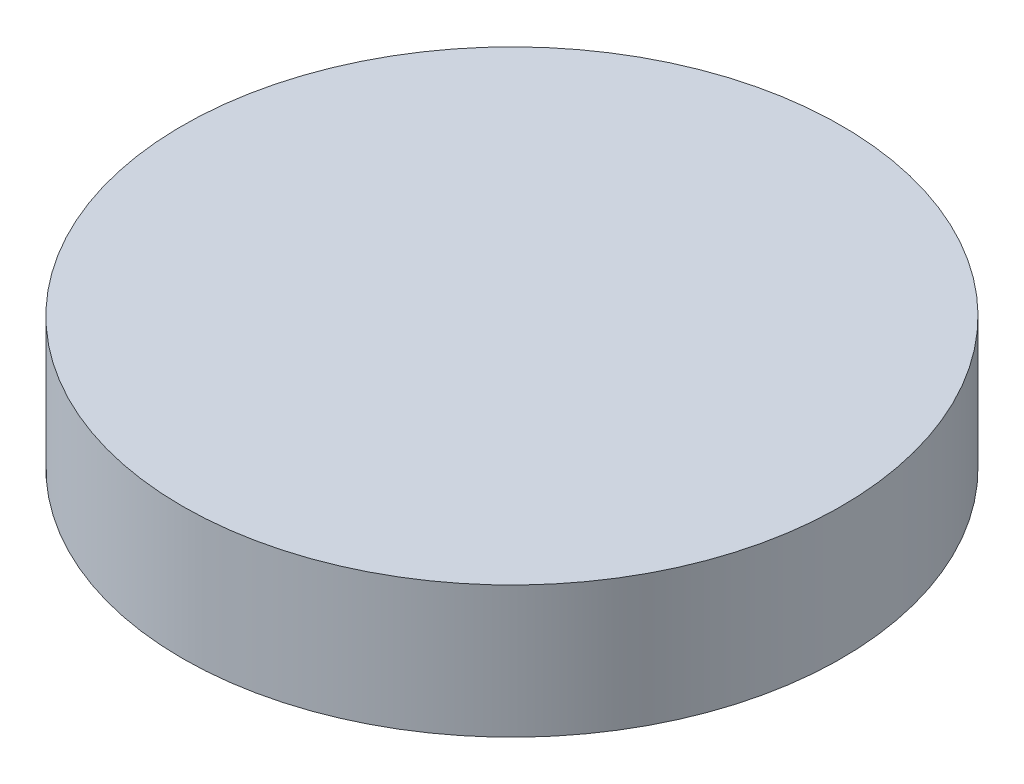
ISO-10303-21;
HEADER;
FILE_DESCRIPTION(('STEP AP214'),'2;1');
FILE_NAME('part.step','',(''),(''),'','','');
FILE_SCHEMA(('AUTOMOTIVE_DESIGN { 1 0 10303 214 1 1 1 1 }'));
ENDSEC;
DATA;
#1=APPLICATION_CONTEXT('core data for automotive mechanical design processes');
#2=APPLICATION_PROTOCOL_DEFINITION('international standard','automotive_design',2000,#1);
#3=PRODUCT_CONTEXT('',#1,'mechanical');
#4=PRODUCT('Part','Part','',(#3));
#5=PRODUCT_RELATED_PRODUCT_CATEGORY('part','',(#4));
#6=PRODUCT_DEFINITION_FORMATION('','',#4);
#7=PRODUCT_DEFINITION_CONTEXT('part definition',#1,'design');
#8=PRODUCT_DEFINITION('design','',#6,#7);
#9=PRODUCT_DEFINITION_SHAPE('','',#8);
#10=(LENGTH_UNIT() NAMED_UNIT(*) SI_UNIT(.MILLI.,.METRE.));
#11=(NAMED_UNIT(*) PLANE_ANGLE_UNIT() SI_UNIT($,.RADIAN.));
#12=(NAMED_UNIT(*) SI_UNIT($,.STERADIAN.) SOLID_ANGLE_UNIT());
#13=UNCERTAINTY_MEASURE_WITH_UNIT(LENGTH_MEASURE(1.E-05),#10,'distance_accuracy_value','');
#14=(GEOMETRIC_REPRESENTATION_CONTEXT(3) GLOBAL_UNCERTAINTY_ASSIGNED_CONTEXT((#13)) GLOBAL_UNIT_ASSIGNED_CONTEXT((#10,
#11,#12)) REPRESENTATION_CONTEXT('',''));
#15=CARTESIAN_POINT('',(0.,0.,0.));
#16=DIRECTION('',(0.,0.,1.));
#17=DIRECTION('',(1.,0.,0.));
#18=AXIS2_PLACEMENT_3D('',#15,#16,#17);
#19=CARTESIAN_POINT('',(0.,1.26999999999999,0.));
#20=DIRECTION('',(0.,-1.,0.));
#21=DIRECTION('',(0.,0.,-1.));
#22=AXIS2_PLACEMENT_3D('',#19,#20,#21);
#23=CYLINDRICAL_SURFACE('',#22,3.175);
#24=CARTESIAN_POINT('',(0.,1.26999999999999,0.));
#25=DIRECTION('',(0.,1.,0.));
#26=DIRECTION('',(0.,0.,1.));
#27=AXIS2_PLACEMENT_3D('',#24,#25,#26);
#28=CIRCLE('',#27,3.175);
#29=CARTESIAN_POINT('',(0.,1.26999999999999,3.175));
#30=VERTEX_POINT('',#29);
#31=EDGE_CURVE('E10',#30,#30,#28,.T.);
#32=ORIENTED_EDGE('',*,*,#31,.F.);
#33=EDGE_LOOP('',(#32));
#34=FACE_BOUND('',#33,.T.);
#35=CARTESIAN_POINT('',(0.,0.,0.));
#36=DIRECTION('',(0.,1.,0.));
#37=DIRECTION('',(0.,0.,1.));
#38=AXIS2_PLACEMENT_3D('',#35,#36,#37);
#39=CIRCLE('',#38,3.175);
#40=CARTESIAN_POINT('',(0.,0.,3.175));
#41=VERTEX_POINT('',#40);
#42=EDGE_CURVE('E31',#41,#41,#39,.T.);
#43=ORIENTED_EDGE('',*,*,#42,.T.);
#44=EDGE_LOOP('',(#43));
#45=FACE_BOUND('',#44,.T.);
#46=ADVANCED_FACE('F28',(#34,#45),#23,.T.);
#47=CARTESIAN_POINT('',(0.,1.26999999999999,0.));
#48=DIRECTION('',(0.,1.,0.));
#49=DIRECTION('',(0.,0.,1.));
#50=AXIS2_PLACEMENT_3D('',#47,#48,#49);
#51=PLANE('',#50);
#52=ORIENTED_EDGE('',*,*,#31,.T.);
#53=EDGE_LOOP('',(#52));
#54=FACE_BOUND('',#53,.T.);
#55=ADVANCED_FACE('F43',(#54),#51,.T.);
#56=CARTESIAN_POINT('',(0.,0.,0.));
#57=DIRECTION('',(0.,1.,0.));
#58=DIRECTION('',(0.,0.,1.));
#59=AXIS2_PLACEMENT_3D('',#56,#57,#58);
#60=PLANE('',#59);
#61=ORIENTED_EDGE('',*,*,#42,.F.);
#62=EDGE_LOOP('',(#61));
#63=FACE_BOUND('',#62,.T.);
#64=ADVANCED_FACE('F41',(#63),#60,.F.);
#65=CLOSED_SHELL('',(#46,#55,#64));
#66=MANIFOLD_SOLID_BREP('B2',#65);
#67=ADVANCED_BREP_SHAPE_REPRESENTATION('',(#18,#66),#14);
#68=SHAPE_DEFINITION_REPRESENTATION(#9,#67);
ENDSEC;
END-ISO-10303-21;
